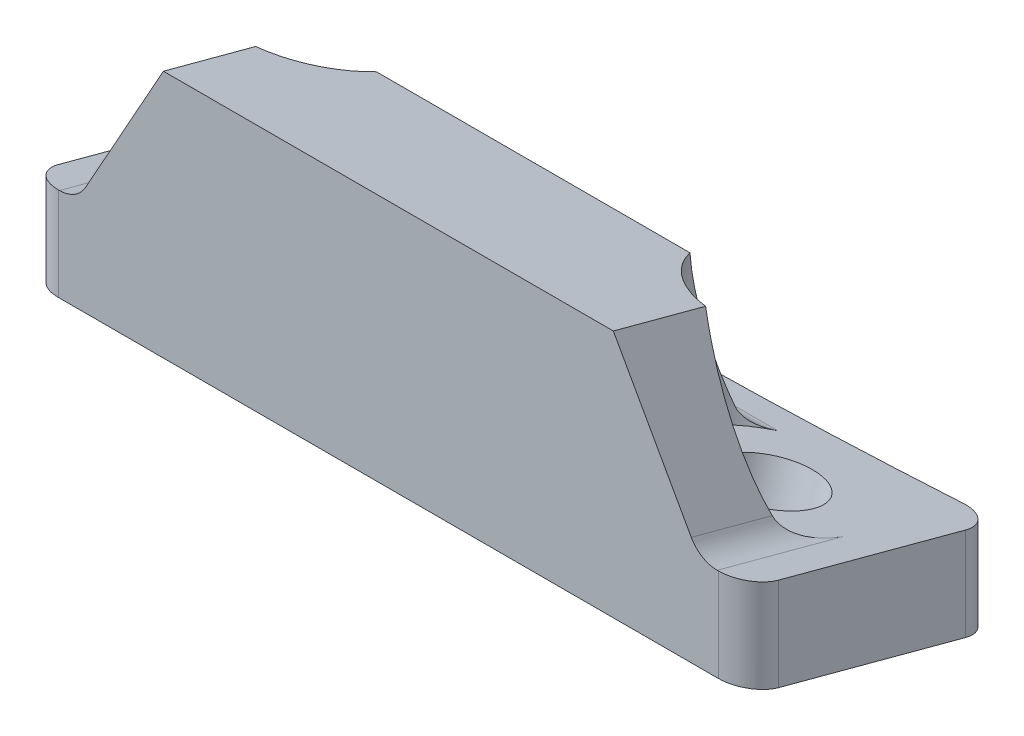
ISO-10303-21;
HEADER;
FILE_DESCRIPTION(('STEP AP214'),'2;1');
FILE_NAME('part.step','',(''),(''),'','','');
FILE_SCHEMA(('AUTOMOTIVE_DESIGN { 1 0 10303 214 1 1 1 1 }'));
ENDSEC;
DATA;
#1=APPLICATION_CONTEXT('core data for automotive mechanical design processes');
#2=APPLICATION_PROTOCOL_DEFINITION('international standard','automotive_design',2000,#1);
#3=PRODUCT_CONTEXT('',#1,'mechanical');
#4=PRODUCT('Part','Part','',(#3));
#5=PRODUCT_RELATED_PRODUCT_CATEGORY('part','',(#4));
#6=PRODUCT_DEFINITION_FORMATION('','',#4);
#7=PRODUCT_DEFINITION_CONTEXT('part definition',#1,'design');
#8=PRODUCT_DEFINITION('design','',#6,#7);
#9=PRODUCT_DEFINITION_SHAPE('','',#8);
#10=(LENGTH_UNIT() NAMED_UNIT(*) SI_UNIT(.MILLI.,.METRE.));
#11=(NAMED_UNIT(*) PLANE_ANGLE_UNIT() SI_UNIT($,.RADIAN.));
#12=(NAMED_UNIT(*) SI_UNIT($,.STERADIAN.) SOLID_ANGLE_UNIT());
#13=UNCERTAINTY_MEASURE_WITH_UNIT(LENGTH_MEASURE(1.E-05),#10,'distance_accuracy_value','');
#14=(GEOMETRIC_REPRESENTATION_CONTEXT(3) GLOBAL_UNCERTAINTY_ASSIGNED_CONTEXT((#13)) GLOBAL_UNIT_ASSIGNED_CONTEXT((#10,
#11,#12)) REPRESENTATION_CONTEXT('',''));
#15=CARTESIAN_POINT('',(0.,0.,0.));
#16=DIRECTION('',(0.,0.,1.));
#17=DIRECTION('',(1.,0.,0.));
#18=AXIS2_PLACEMENT_3D('',#15,#16,#17);
#19=CARTESIAN_POINT('',(12.,1.0352761804101,3.86370330515627));
#20=DIRECTION('',(0.,0.,-1.));
#21=DIRECTION('',(-1.,0.,0.));
#22=AXIS2_PLACEMENT_3D('',#19,#20,#21);
#23=PLANE('',#22);
#24=DIRECTION('',(-1.,0.,0.));
#25=VECTOR('',#24,1.);
#26=CARTESIAN_POINT('',(12.,1.0352761804101,3.86370330515627));
#27=LINE('',#26,#25);
#28=CARTESIAN_POINT('',(11.,1.0352761804101,3.86370330515627));
#29=VERTEX_POINT('',#28);
#30=CARTESIAN_POINT('',(-11.,1.0352761804101,3.86370330515627));
#31=VERTEX_POINT('',#30);
#32=EDGE_CURVE('E181',#29,#31,#27,.T.);
#33=ORIENTED_EDGE('',*,*,#32,.F.);
#34=DIRECTION('',(0.,-1.,0.));
#35=VECTOR('',#34,1.);
#36=CARTESIAN_POINT('',(11.,1.0352761804101,3.86370330515627));
#37=LINE('',#36,#35);
#38=CARTESIAN_POINT('',(11.,4.14110472164035,3.86370330515627));
#39=VERTEX_POINT('',#38);
#40=EDGE_CURVE('E242',#29,#39,#37,.F.);
#41=ORIENTED_EDGE('',*,*,#40,.T.);
#42=DIRECTION('',(-1.,0.,0.));
#43=VECTOR('',#42,1.);
#44=CARTESIAN_POINT('',(12.,4.14110472164035,3.86370330515627));
#45=LINE('',#44,#43);
#46=CARTESIAN_POINT('',(10.9641016151378,4.14110472164035,3.86370330515627));
#47=VERTEX_POINT('',#46);
#48=EDGE_CURVE('E484',#39,#47,#45,.T.);
#49=ORIENTED_EDGE('',*,*,#48,.T.);
#50=CARTESIAN_POINT('',(10.9641016151378,5.17638090205044,3.86370330515627));
#51=DIRECTION('',(0.,0.,-1.));
#52=DIRECTION('',(0.,1.,0.));
#53=AXIS2_PLACEMENT_3D('',#50,#51,#52);
#54=ELLIPSE('',#53,1.03527618041008,1.);
#55=CARTESIAN_POINT('',(10.0980762113533,4.65874281184539,3.86370330515627));
#56=VERTEX_POINT('',#55);
#57=EDGE_CURVE('E12',#47,#56,#54,.T.);
#58=ORIENTED_EDGE('',*,*,#57,.T.);
#59=DIRECTION('',(-0.487058473848149,0.873369362327711,0.));
#60=VECTOR('',#59,1.);
#61=CARTESIAN_POINT('',(12.0906191989615,1.08581247198543,3.86370330515627));
#62=LINE('',#61,#60);
#63=CARTESIAN_POINT('',(7.5,9.31748562369077,3.86370330515627));
#64=VERTEX_POINT('',#63);
#65=EDGE_CURVE('E180',#64,#56,#62,.F.);
#66=ORIENTED_EDGE('',*,*,#65,.F.);
#67=DIRECTION('',(-1.,0.,0.));
#68=VECTOR('',#67,1.);
#69=CARTESIAN_POINT('',(12.,9.31748562369077,3.86370330515627));
#70=LINE('',#69,#68);
#71=CARTESIAN_POINT('',(-7.5,9.31748562369077,3.86370330515627));
#72=VERTEX_POINT('',#71);
#73=EDGE_CURVE('E172',#64,#72,#70,.T.);
#74=ORIENTED_EDGE('',*,*,#73,.T.);
#75=DIRECTION('',(-0.487058473848149,-0.873369362327711,0.));
#76=VECTOR('',#75,1.);
#77=CARTESIAN_POINT('',(-6.39719623222663,11.294979241291,3.86370330515627));
#78=LINE('',#77,#76);
#79=CARTESIAN_POINT('',(-10.0980762113533,4.65874281184539,3.86370330515627));
#80=VERTEX_POINT('',#79);
#81=EDGE_CURVE('E153',#80,#72,#78,.F.);
#82=ORIENTED_EDGE('',*,*,#81,.F.);
#83=CARTESIAN_POINT('',(-10.9641016151378,5.17638090205044,3.86370330515627));
#84=DIRECTION('',(0.,0.,-1.));
#85=DIRECTION('',(0.,-1.,0.));
#86=AXIS2_PLACEMENT_3D('',#83,#84,#85);
#87=ELLIPSE('',#86,1.03527618041008,1.);
#88=CARTESIAN_POINT('',(-10.9641016151378,4.14110472164035,3.86370330515627));
#89=VERTEX_POINT('',#88);
#90=EDGE_CURVE('E253',#80,#89,#87,.T.);
#91=ORIENTED_EDGE('',*,*,#90,.T.);
#92=CARTESIAN_POINT('',(-11.,4.14110472164035,3.86370330515627));
#93=VERTEX_POINT('',#92);
#94=EDGE_CURVE('E490',#89,#93,#45,.T.);
#95=ORIENTED_EDGE('',*,*,#94,.T.);
#96=DIRECTION('',(0.,-1.,0.));
#97=VECTOR('',#96,1.);
#98=CARTESIAN_POINT('',(-11.,1.0352761804101,3.86370330515627));
#99=LINE('',#98,#97);
#100=EDGE_CURVE('E240',#93,#31,#99,.T.);
#101=ORIENTED_EDGE('',*,*,#100,.T.);
#102=EDGE_LOOP('',(#33,#41,#49,#58,#66,#74,#82,#91,#95,#101));
#103=FACE_BOUND('',#102,.T.);
#104=ADVANCED_FACE('F33',(#103),#23,.F.);
#105=CARTESIAN_POINT('',(12.,9.31748562369077,3.86370330515627));
#106=DIRECTION('',(0.,-0.965925826289067,0.258819045102525));
#107=DIRECTION('',(0.,-0.258819045102525,-0.965925826289067));
#108=AXIS2_PLACEMENT_3D('',#105,#106,#107);
#109=PLANE('',#108);
#110=DIRECTION('',(-1.,0.,0.));
#111=VECTOR('',#110,1.);
#112=CARTESIAN_POINT('',(-7.5,8.02339039817815,-0.965925826289068));
#113=LINE('',#112,#111);
#114=CARTESIAN_POINT('',(5.22651954819752,8.02339039817815,-0.965925826289069));
#115=VERTEX_POINT('',#114);
#116=CARTESIAN_POINT('',(-5.22651954819752,8.02339039817815,-0.965925826289069));
#117=VERTEX_POINT('',#116);
#118=EDGE_CURVE('E526',#115,#117,#113,.T.);
#119=ORIENTED_EDGE('',*,*,#118,.T.);
#120=CARTESIAN_POINT('',(-8.,7.72740661031254,-2.0705523608202));
#121=DIRECTION('',(0.,-0.965925826289067,0.258819045102525));
#122=DIRECTION('',(0.,-0.258819045102525,-0.965925826289067));
#123=AXIS2_PLACEMENT_3D('',#120,#121,#122);
#124=CIRCLE('',#123,3.);
#125=CARTESIAN_POINT('',(-7.5,8.49300367041864,0.786694765621074));
#126=VERTEX_POINT('',#125);
#127=EDGE_CURVE('E174',#117,#126,#124,.T.);
#128=ORIENTED_EDGE('',*,*,#127,.T.);
#129=DIRECTION('',(0.,0.258819045102525,0.965925826289067));
#130=VECTOR('',#129,1.);
#131=CARTESIAN_POINT('',(-7.5,8.02339039817815,-0.965925826289068));
#132=LINE('',#131,#130);
#133=EDGE_CURVE('E157',#126,#72,#132,.T.);
#134=ORIENTED_EDGE('',*,*,#133,.T.);
#135=ORIENTED_EDGE('',*,*,#73,.F.);
#136=DIRECTION('',(0.,-0.258819045102525,-0.965925826289067));
#137=VECTOR('',#136,1.);
#138=CARTESIAN_POINT('',(7.5,8.02339039817815,-0.965925826289068));
#139=LINE('',#138,#137);
#140=CARTESIAN_POINT('',(7.5,8.49300367041864,0.786694765621073));
#141=VERTEX_POINT('',#140);
#142=EDGE_CURVE('E176',#64,#141,#139,.T.);
#143=ORIENTED_EDGE('',*,*,#142,.T.);
#144=CARTESIAN_POINT('',(8.,7.72740661031254,-2.0705523608202));
#145=DIRECTION('',(0.,-0.965925826289067,0.258819045102525));
#146=DIRECTION('',(0.,-0.258819045102525,-0.965925826289067));
#147=AXIS2_PLACEMENT_3D('',#144,#145,#146);
#148=CIRCLE('',#147,3.);
#149=EDGE_CURVE('E184',#141,#115,#148,.T.);
#150=ORIENTED_EDGE('',*,*,#149,.T.);
#151=EDGE_LOOP('',(#119,#128,#134,#135,#143,#150));
#152=FACE_BOUND('',#151,.T.);
#153=ADVANCED_FACE('F170',(#152),#109,.F.);
#154=CARTESIAN_POINT('',(-8.,27.0459231360939,-7.24693326287069));
#155=DIRECTION('',(0.,-0.965925826289067,0.258819045102525));
#156=DIRECTION('',(0.,-0.258819045102525,-0.965925826289067));
#157=AXIS2_PLACEMENT_3D('',#154,#155,#156);
#158=CYLINDRICAL_SURFACE('',#157,3.);
#159=CARTESIAN_POINT('',(-8.,5.81413732911589,-1.55789340202027));
#160=DIRECTION('',(0.,-0.258819045102518,0.965925826289069));
#161=DIRECTION('',(0.,-0.965925826289069,-0.258819045102518));
#162=AXIS2_PLACEMENT_3D('',#159,#160,#161);
#163=ELLIPSE('',#162,5.99999999999999,3.);
#164=CARTESIAN_POINT('',(-5.37617070731915,3.00429257575129,-2.31078903454113));
#165=VERTEX_POINT('',#164);
#166=EDGE_CURVE('E501',#165,#117,#163,.T.);
#167=ORIENTED_EDGE('',*,*,#166,.F.);
#168=CARTESIAN_POINT('',(-5.37617070731915,3.00429257575129,-2.31078903454113));
#169=CARTESIAN_POINT('',(-5.38375375809876,2.97786334421747,-2.31786821691371));
#170=CARTESIAN_POINT('',(-5.39196401316921,2.95191192237957,-2.3259876323711));
#171=CARTESIAN_POINT('',(-5.40963843413776,2.90114684418095,-2.34413393858338));
#172=CARTESIAN_POINT('',(-5.41910179833776,2.87633247392116,-2.35415961155004));
#173=CARTESIAN_POINT('',(-5.44923189637865,2.80418824423588,-2.38668564680003));
#174=CARTESIAN_POINT('',(-5.47175468199593,2.7587479079092,-2.41174869351753));
#175=CARTESIAN_POINT('',(-5.52143919647684,2.67415751293252,-2.4669702697651));
#176=CARTESIAN_POINT('',(-5.54859153073691,2.63499502109806,-2.49711847882375));
#177=CARTESIAN_POINT('',(-5.60719285449142,2.56317491219571,-2.560893434431));
#178=CARTESIAN_POINT('',(-5.63864924457027,2.53052874262612,-2.59452614766534));
#179=CARTESIAN_POINT('',(-5.71848263450526,2.46014253677542,-2.67734136975477));
#180=CARTESIAN_POINT('',(-5.76863698035313,2.4254796329155,-2.72742085057355));
#181=CARTESIAN_POINT('',(-5.87477943039827,2.36756873424914,-2.82795832889667));
#182=CARTESIAN_POINT('',(-5.93077489314333,2.34433535390946,-2.8784167276889));
#183=CARTESIAN_POINT('',(-6.00687856160768,2.32024771274354,-2.9431416989836));
#184=CARTESIAN_POINT('',(-6.02499050624652,2.3150364985999,-2.95827734201769));
#185=CARTESIAN_POINT('',(-6.06154675934484,2.30548298911001,-2.98828072004946));
#186=CARTESIAN_POINT('',(-6.07998963298905,2.30113762677347,-3.00314922458455));
#187=CARTESIAN_POINT('',(-6.0986209555527,2.29718579456474,-3.01789581572768));
#188=B_SPLINE_CURVE_WITH_KNOTS('',3,(#168,#169,#170,#171,#172,#173,#174,#175,#176,#177,#178,
#179,#180,#181,#182,#183,#184,#185,#186,#187),.UNSPECIFIED.,.F.,.F.,(4,2,2,2,2,2,2,2,2,4),(0.,
0.0851142200188443,0.17017424749453,0.338991805846359,0.507470778612254,0.67624316983897,
0.911644691261538,1.14734643370626,1.21985180629734,1.2920955996428),.UNSPECIFIED.);
#189=CARTESIAN_POINT('',(-6.0986209555527,2.29718579456474,-3.01789581572768));
#190=VERTEX_POINT('',#189);
#191=EDGE_CURVE('E263',#165,#190,#188,.T.);
#192=ORIENTED_EDGE('',*,*,#191,.T.);
#193=CARTESIAN_POINT('',(-8.,2.8977774788672,-0.776457135307574));
#194=DIRECTION('',(0.,-0.965925826289067,0.258819045102525));
#195=DIRECTION('',(0.,-0.258819045102525,-0.965925826289067));
#196=AXIS2_PLACEMENT_3D('',#193,#194,#195);
#197=CIRCLE('',#196,3.);
#198=CARTESIAN_POINT('',(-10.9641016151378,3.01753593877125,-0.32951247830948));
#199=VERTEX_POINT('',#198);
#200=EDGE_CURVE('E195',#190,#199,#197,.T.);
#201=ORIENTED_EDGE('',*,*,#200,.T.);
#202=CARTESIAN_POINT('',(-10.9641016151378,3.01753593877125,-0.32951247830948));
#203=CARTESIAN_POINT('',(-10.9577962400731,3.02799304848034,-0.290498238765388));
#204=CARTESIAN_POINT('',(-10.9506659779932,3.03846670954159,-0.251626660901893));
#205=CARTESIAN_POINT('',(-10.9347662267443,3.05954956486411,-0.174253837071816));
#206=CARTESIAN_POINT('',(-10.9259966019882,3.07015877026821,-0.135752622014037));
#207=CARTESIAN_POINT('',(-10.8971939146216,3.10239940050016,-0.0207326081471663));
#208=CARTESIAN_POINT('',(-10.8747015915625,3.12438781094838,0.0550883979561434));
#209=CARTESIAN_POINT('',(-10.8231327612515,3.17062467204328,0.204565567009902));
#210=CARTESIAN_POINT('',(-10.7939997835879,3.19489139037663,0.278196654125814));
#211=CARTESIAN_POINT('',(-10.7296382872361,3.24700086843709,0.421305568859992));
#212=CARTESIAN_POINT('',(-10.6944199573135,3.27483763103691,0.490790081608333));
#213=CARTESIAN_POINT('',(-10.6211972562213,3.33381960985904,0.619442680891861));
#214=CARTESIAN_POINT('',(-10.5835687987088,3.36458907007985,0.678992994739172));
#215=CARTESIAN_POINT('',(-10.5045916224283,3.4326070035392,0.791592879516509));
#216=CARTESIAN_POINT('',(-10.4632464994022,3.46984924647545,0.844648618785602));
#217=CARTESIAN_POINT('',(-10.3779406759402,3.55331638855543,0.942952632993078));
#218=CARTESIAN_POINT('',(-10.3339488769981,3.59967447678677,0.988063623923384));
#219=CARTESIAN_POINT('',(-10.2473683056148,3.70241878619754,1.06649495576648));
#220=CARTESIAN_POINT('',(-10.2047730742829,3.75874760987337,1.09987968080616));
#221=CARTESIAN_POINT('',(-10.153451306071,3.83841470269665,1.13395159547056));
#222=CARTESIAN_POINT('',(-10.1418813174784,3.85725775178436,1.14117237446025));
#223=CARTESIAN_POINT('',(-10.1194250476986,3.89583679658623,1.15428752043789));
#224=CARTESIAN_POINT('',(-10.1085398979309,3.91557418186318,1.16017973195015));
#225=CARTESIAN_POINT('',(-10.0980762113533,3.93572931252477,1.16538019113359));
#226=B_SPLINE_CURVE_WITH_KNOTS('',3,(#202,#203,#204,#205,#206,#207,#208,#209,#210,#211,#212,
#213,#214,#215,#216,#217,#218,#219,#220,#221,#222,#223,#224,#225),.UNSPECIFIED.,.F.,.F.,(4,2,2,
2,2,2,2,2,2,2,2,4),(0.,0.122623445663207,0.24525703765572,0.491194287646272,0.739306573032794,
0.987007397167188,1.21710336519374,1.44697907131479,1.68050331891869,1.91272456548921,
1.98245432124352,2.05229640573011),.UNSPECIFIED.);
#227=CARTESIAN_POINT('',(-10.0980762113533,3.93572931252477,1.16538019113359));
#228=VERTEX_POINT('',#227);
#229=EDGE_CURVE('E255',#199,#228,#226,.T.);
#230=ORIENTED_EDGE('',*,*,#229,.T.);
#231=CARTESIAN_POINT('',(-8.,6.89089030657473,-1.84640849277818));
#232=DIRECTION('',(0.866025403784438,-0.482962913144534,0.129409522551263));
#233=DIRECTION('',(-0.500000000000001,-0.836516303737807,0.224143868042017));
#234=AXIS2_PLACEMENT_3D('',#231,#232,#233);
#235=ELLIPSE('',#234,5.99999999999999,3.);
#236=EDGE_CURVE('E164',#126,#228,#235,.T.);
#237=ORIENTED_EDGE('',*,*,#236,.F.);
#238=ORIENTED_EDGE('',*,*,#127,.F.);
#239=EDGE_LOOP('',(#167,#192,#201,#230,#237,#238));
#240=FACE_BOUND('',#239,.T.);
#241=ADVANCED_FACE('F270',(#240),#158,.F.);
#242=CARTESIAN_POINT('',(8.,27.0459231360939,-7.24693326287069));
#243=DIRECTION('',(0.,-0.965925826289067,0.258819045102525));
#244=DIRECTION('',(0.,-0.258819045102525,-0.965925826289067));
#245=AXIS2_PLACEMENT_3D('',#242,#243,#244);
#246=CYLINDRICAL_SURFACE('',#245,3.);
#247=CARTESIAN_POINT('',(8.,5.81413732911589,-1.55789340202027));
#248=DIRECTION('',(0.,-0.258819045102518,0.965925826289069));
#249=DIRECTION('',(0.,-0.965925826289069,-0.258819045102518));
#250=AXIS2_PLACEMENT_3D('',#247,#248,#249);
#251=ELLIPSE('',#250,5.99999999999999,3.);
#252=CARTESIAN_POINT('',(5.37617070731915,3.00429257575129,-2.31078903454113));
#253=VERTEX_POINT('',#252);
#254=EDGE_CURVE('E498',#115,#253,#251,.T.);
#255=ORIENTED_EDGE('',*,*,#254,.F.);
#256=ORIENTED_EDGE('',*,*,#149,.F.);
#257=CARTESIAN_POINT('',(8.,6.89089030657473,-1.84640849277818));
#258=DIRECTION('',(-0.866025403784438,-0.482962913144534,0.129409522551263));
#259=DIRECTION('',(0.500000000000001,-0.836516303737807,0.224143868042017));
#260=AXIS2_PLACEMENT_3D('',#257,#258,#259);
#261=ELLIPSE('',#260,5.99999999999999,3.);
#262=CARTESIAN_POINT('',(10.0980762113533,3.93572931252477,1.16538019113359));
#263=VERTEX_POINT('',#262);
#264=EDGE_CURVE('E489',#263,#141,#261,.T.);
#265=ORIENTED_EDGE('',*,*,#264,.F.);
#266=CARTESIAN_POINT('',(10.0980762113533,3.93572931252477,1.16538019113359));
#267=CARTESIAN_POINT('',(10.1117982142394,3.90929309243127,1.15856637839141));
#268=CARTESIAN_POINT('',(10.1262474213873,3.88358004349536,1.15055030645764));
#269=CARTESIAN_POINT('',(10.1562485545229,3.83370840366169,1.13226080116993));
#270=CARTESIAN_POINT('',(10.1717984552246,3.80954710618316,1.12199144432042));
#271=CARTESIAN_POINT('',(10.2192335184896,3.74002750181159,1.08827744948226));
#272=CARTESIAN_POINT('',(10.2522807482687,3.69693835983757,1.06174074586283));
#273=CARTESIAN_POINT('',(10.3285268233946,3.60571215707482,0.99331898453359));
#274=CARTESIAN_POINT('',(10.3719948751602,3.55949939324317,0.949218025456272));
#275=CARTESIAN_POINT('',(10.4573078965653,3.47534376464449,0.852000380081372));
#276=CARTESIAN_POINT('',(10.4991426553866,3.43744765254601,0.798835567410932));
#277=CARTESIAN_POINT('',(10.5699012596892,3.37626171674853,0.69883111188958));
#278=CARTESIAN_POINT('',(10.599588036176,3.35161428011378,0.653330477543673));
#279=CARTESIAN_POINT('',(10.656263960597,3.30543312552946,0.559148501790381));
#280=CARTESIAN_POINT('',(10.6832514970196,3.28390126426784,0.510465288646637));
#281=CARTESIAN_POINT('',(10.734217862769,3.24318927514343,0.410540136984989));
#282=CARTESIAN_POINT('',(10.7581931364648,3.22401192711113,0.359295272594246));
#283=CARTESIAN_POINT('',(10.8029135062696,3.18737309062844,0.254816251063502));
#284=CARTESIAN_POINT('',(10.823657650732,3.16991210824624,0.201581513559977));
#285=CARTESIAN_POINT('',(10.8700120455029,3.12885331738159,0.0702653150898261));
#286=CARTESIAN_POINT('',(10.8938643026512,3.10585536108185,-0.00863318385964483));
#287=CARTESIAN_POINT('',(10.924248527005,3.07222920816286,-0.128271260401016));
#288=CARTESIAN_POINT('',(10.9334579190889,3.06119746272078,-0.168243700700089));
#289=CARTESIAN_POINT('',(10.9501086728695,3.03928340338319,-0.248596366115771));
#290=CARTESIAN_POINT('',(10.9575500145703,3.02840109117903,-0.288976595838917));
#291=CARTESIAN_POINT('',(10.9641016151378,3.01753593877125,-0.329512478309485));
#292=B_SPLINE_CURVE_WITH_KNOTS('',3,(#266,#267,#268,#269,#270,#271,#272,#273,#274,#275,#276,
#277,#278,#279,#280,#281,#282,#283,#284,#285,#286,#287,#288,#289,#290,#291),.UNSPECIFIED.,.F.,
.F.,(4,2,2,2,2,2,2,2,2,2,2,2,4),(0.,0.0915735029261373,0.182982682979397,0.363402523674479,
0.593955383632091,0.825772877269919,1.00451115625662,1.18335551721012,1.36240903876638,
1.54151519665276,1.79784131007094,1.9252413320123,2.0526427947236),.UNSPECIFIED.);
#293=CARTESIAN_POINT('',(10.9641016151378,3.01753593877125,-0.329512478309485));
#294=VERTEX_POINT('',#293);
#295=EDGE_CURVE('E41',#263,#294,#292,.T.);
#296=ORIENTED_EDGE('',*,*,#295,.T.);
#297=CARTESIAN_POINT('',(8.,2.8977774788672,-0.776457135307574));
#298=DIRECTION('',(0.,-0.965925826289067,0.258819045102525));
#299=DIRECTION('',(0.,-0.258819045102525,-0.965925826289067));
#300=AXIS2_PLACEMENT_3D('',#297,#298,#299);
#301=CIRCLE('',#300,3.);
#302=CARTESIAN_POINT('',(6.0986209555527,2.29718579456474,-3.01789581572768));
#303=VERTEX_POINT('',#302);
#304=EDGE_CURVE('E505',#294,#303,#301,.T.);
#305=ORIENTED_EDGE('',*,*,#304,.T.);
#306=CARTESIAN_POINT('',(6.0986209555527,2.29718579456474,-3.01789581572768));
#307=CARTESIAN_POINT('',(6.0660710457246,2.30408976614552,-2.99214173435292));
#308=CARTESIAN_POINT('',(6.03407340194407,2.31220160299732,-2.96597983764932));
#309=CARTESIAN_POINT('',(5.97129332322677,2.33115118908544,-2.91306210115806));
#310=CARTESIAN_POINT('',(5.94051344084748,2.34199434596548,-2.88630518026383));
#311=CARTESIAN_POINT('',(5.88015741267718,2.36679568691229,-2.83229726937542));
#312=CARTESIAN_POINT('',(5.85059360880098,2.38077937208263,-2.80504401568142));
#313=CARTESIAN_POINT('',(5.79319107379338,2.41206821097027,-2.75068393357643));
#314=CARTESIAN_POINT('',(5.765350900001,2.42937053591197,-2.72357700053139));
#315=CARTESIAN_POINT('',(5.69840270514866,2.4769192033729,-2.65679085963854));
#316=CARTESIAN_POINT('',(5.66045720985126,2.50935399031296,-2.61745903967394));
#317=CARTESIAN_POINT('',(5.58975175190037,2.582494320062,-2.54221007428229));
#318=CARTESIAN_POINT('',(5.55697478896137,2.62317169785593,-2.5062818962123));
#319=CARTESIAN_POINT('',(5.50088403580178,2.70698147846072,-2.44419316509643));
#320=CARTESIAN_POINT('',(5.47689992110008,2.74917567583935,-2.41737330597134));
#321=CARTESIAN_POINT('',(5.43363399630301,2.83898299193823,-2.36969436541329));
#322=CARTESIAN_POINT('',(5.41434441045643,2.88658695566309,-2.3488254172461));
#323=CARTESIAN_POINT('',(5.39367904254046,2.94736007908501,-2.32779870312732));
#324=CARTESIAN_POINT('',(5.39000699318979,2.95862039362511,-2.32412527337734));
#325=CARTESIAN_POINT('',(5.38290765670499,2.98132114505027,-2.31716591602264));
#326=CARTESIAN_POINT('',(5.37948009907563,2.992761365233,-2.3138795574717));
#327=CARTESIAN_POINT('',(5.37617070731908,3.00429257575125,-2.31078903454108));
#328=B_SPLINE_CURVE_WITH_KNOTS('',3,(#306,#307,#308,#309,#310,#311,#312,#313,#314,#315,#316,
#317,#318,#319,#320,#321,#322,#323,#324,#325,#326,#327),.UNSPECIFIED.,.F.,.F.,(4,2,2,2,2,2,2,2,
2,2,4),(0.,0.126237192897191,0.252726310252718,0.380282248193717,0.507729938068686,
0.697621784839899,0.886875391450239,1.05253617981596,1.21792068052511,1.25511669696037,
1.29227090166657),.UNSPECIFIED.);
#329=EDGE_CURVE('E290',#303,#253,#328,.T.);
#330=ORIENTED_EDGE('',*,*,#329,.T.);
#331=EDGE_LOOP('',(#255,#256,#265,#296,#305,#330));
#332=FACE_BOUND('',#331,.T.);
#333=ADVANCED_FACE('F299',(#332),#246,.F.);
#334=CARTESIAN_POINT('',(12.,1.0352761804101,3.86370330515627));
#335=DIRECTION('',(0.,0.965925826289067,-0.258819045102525));
#336=DIRECTION('',(0.,0.258819045102525,0.965925826289067));
#337=AXIS2_PLACEMENT_3D('',#334,#335,#336);
#338=PLANE('',#337);
#339=CARTESIAN_POINT('',(-8.,0.,0.));
#340=DIRECTION('',(0.,-0.965925826289067,0.258819045102525));
#341=DIRECTION('',(0.,-0.258819045102525,-0.965925826289067));
#342=AXIS2_PLACEMENT_3D('',#339,#340,#341);
#343=CIRCLE('',#342,1.55);
#344=CARTESIAN_POINT('',(-8.,-0.401169519908913,-1.49718503074805));
#345=VERTEX_POINT('',#344);
#346=EDGE_CURVE('E508',#345,#345,#343,.T.);
#347=ORIENTED_EDGE('',*,*,#346,.F.);
#348=EDGE_LOOP('',(#347));
#349=FACE_BOUND('',#348,.T.);
#350=CARTESIAN_POINT('',(8.,0.,0.));
#351=DIRECTION('',(0.,-0.965925826289067,0.258819045102525));
#352=DIRECTION('',(0.,0.258819045102525,0.965925826289067));
#353=AXIS2_PLACEMENT_3D('',#350,#351,#352);
#354=CIRCLE('',#353,1.55);
#355=CARTESIAN_POINT('',(8.,0.401169519908913,1.49718503074805));
#356=VERTEX_POINT('',#355);
#357=EDGE_CURVE('E198',#356,#356,#354,.T.);
#358=ORIENTED_EDGE('',*,*,#357,.F.);
#359=EDGE_LOOP('',(#358));
#360=FACE_BOUND('',#359,.T.);
#361=DIRECTION('',(0.,-0.258819045102525,-0.965925826289067));
#362=VECTOR('',#361,1.);
#363=CARTESIAN_POINT('',(12.,1.0352761804101,3.86370330515627));
#364=LINE('',#363,#362);
#365=CARTESIAN_POINT('',(12.,0.767326987978972,2.86370330515627));
#366=VERTEX_POINT('',#365);
#367=CARTESIAN_POINT('',(12.,-0.905956884871102,-3.38107712380572));
#368=VERTEX_POINT('',#367);
#369=EDGE_CURVE('E182',#366,#368,#364,.T.);
#370=ORIENTED_EDGE('',*,*,#369,.F.);
#371=CARTESIAN_POINT('',(11.,0.767326987978972,2.86370330515627));
#372=DIRECTION('',(0.,0.965925826289067,-0.258819045102525));
#373=DIRECTION('',(0.,-0.258819045102525,-0.965925826289067));
#374=AXIS2_PLACEMENT_3D('',#371,#372,#373);
#375=ELLIPSE('',#374,1.03527618041008,1.);
#376=EDGE_CURVE('E56',#366,#29,#375,.F.);
#377=ORIENTED_EDGE('',*,*,#376,.T.);
#378=ORIENTED_EDGE('',*,*,#32,.T.);
#379=CARTESIAN_POINT('',(-11.,0.767326987978972,2.86370330515627));
#380=DIRECTION('',(0.,0.965925826289067,-0.258819045102525));
#381=DIRECTION('',(0.,0.258819045102525,0.965925826289067));
#382=AXIS2_PLACEMENT_3D('',#379,#380,#381);
#383=ELLIPSE('',#382,1.03527618041008,1.);
#384=CARTESIAN_POINT('',(-12.,0.767326987978972,2.86370330515627));
#385=VERTEX_POINT('',#384);
#386=EDGE_CURVE('E48',#31,#385,#383,.F.);
#387=ORIENTED_EDGE('',*,*,#386,.T.);
#388=DIRECTION('',(0.,-0.258819045102525,-0.965925826289067));
#389=VECTOR('',#388,1.);
#390=CARTESIAN_POINT('',(-12.,1.0352761804101,3.86370330515627));
#391=LINE('',#390,#389);
#392=CARTESIAN_POINT('',(-12.,-0.905956884871102,-3.38107712380572));
#393=VERTEX_POINT('',#392);
#394=EDGE_CURVE('E187',#385,#393,#391,.T.);
#395=ORIENTED_EDGE('',*,*,#394,.T.);
#396=CARTESIAN_POINT('',(-11.,-0.905956884871102,-3.38107712380573));
#397=DIRECTION('',(0.,0.965925826289067,-0.258819045102525));
#398=DIRECTION('',(0.,0.258819045102525,0.965925826289067));
#399=AXIS2_PLACEMENT_3D('',#396,#397,#398);
#400=ELLIPSE('',#399,1.03527618041008,1.);
#401=CARTESIAN_POINT('',(-10.9126984126984,-1.17288302788301,-4.37725905139454));
#402=VERTEX_POINT('',#401);
#403=EDGE_CURVE('E236',#393,#402,#400,.F.);
#404=ORIENTED_EDGE('',*,*,#403,.T.);
#405=CARTESIAN_POINT('',(0.,-34.5386509043723,-128.9));
#406=DIRECTION('',(0.,0.965925826289067,-0.258819045102525));
#407=DIRECTION('',(0.,0.258819045102525,0.965925826289067));
#408=AXIS2_PLACEMENT_3D('',#405,#406,#407);
#409=ELLIPSE('',#408,129.409522551261,125.);
#410=CARTESIAN_POINT('',(10.9126984126984,-1.17288302788301,-4.37725905139454));
#411=VERTEX_POINT('',#410);
#412=EDGE_CURVE('E163',#402,#411,#409,.T.);
#413=ORIENTED_EDGE('',*,*,#412,.T.);
#414=CARTESIAN_POINT('',(11.,-0.905956884871102,-3.38107712380573));
#415=DIRECTION('',(0.,0.965925826289067,-0.258819045102525));
#416=DIRECTION('',(0.,0.258819045102525,0.965925826289067));
#417=AXIS2_PLACEMENT_3D('',#414,#415,#416);
#418=ELLIPSE('',#417,1.03527618041008,1.);
#419=EDGE_CURVE('E234',#411,#368,#418,.F.);
#420=ORIENTED_EDGE('',*,*,#419,.T.);
#421=EDGE_LOOP('',(#370,#377,#378,#387,#395,#404,#413,#420));
#422=FACE_BOUND('',#421,.T.);
#423=ADVANCED_FACE('F303',(#349,#360,#422),#338,.F.);
#424=CARTESIAN_POINT('',(12.,0.,0.));
#425=DIRECTION('',(-1.,0.,0.));
#426=DIRECTION('',(0.,0.,1.));
#427=AXIS2_PLACEMENT_3D('',#424,#425,#426);
#428=PLANE('',#427);
#429=DIRECTION('',(0.,0.258819045102525,0.965925826289067));
#430=VECTOR('',#429,1.);
#431=CARTESIAN_POINT('',(12.,2.8977774788672,-0.776457135307574));
#432=LINE('',#431,#430);
#433=CARTESIAN_POINT('',(12.,2.19987165635915,-3.38107712380573));
#434=VERTEX_POINT('',#433);
#435=CARTESIAN_POINT('',(12.,3.87315552920922,2.86370330515627));
#436=VERTEX_POINT('',#435);
#437=EDGE_CURVE('E479',#434,#436,#432,.T.);
#438=ORIENTED_EDGE('',*,*,#437,.T.);
#439=DIRECTION('',(0.,-1.,0.));
#440=VECTOR('',#439,1.);
#441=CARTESIAN_POINT('',(12.,0.,2.86370330515627));
#442=LINE('',#441,#440);
#443=EDGE_CURVE('E231',#436,#366,#442,.T.);
#444=ORIENTED_EDGE('',*,*,#443,.T.);
#445=ORIENTED_EDGE('',*,*,#369,.T.);
#446=DIRECTION('',(0.,1.,0.));
#447=VECTOR('',#446,1.);
#448=CARTESIAN_POINT('',(12.,0.,-3.38107712380573));
#449=LINE('',#448,#447);
#450=EDGE_CURVE('E228',#368,#434,#449,.T.);
#451=ORIENTED_EDGE('',*,*,#450,.T.);
#452=EDGE_LOOP('',(#438,#444,#445,#451));
#453=FACE_BOUND('',#452,.T.);
#454=ADVANCED_FACE('F316',(#453),#428,.F.);
#455=CARTESIAN_POINT('',(-12.,0.,0.));
#456=DIRECTION('',(-1.,0.,0.));
#457=DIRECTION('',(0.,0.,1.));
#458=AXIS2_PLACEMENT_3D('',#455,#456,#457);
#459=PLANE('',#458);
#460=ORIENTED_EDGE('',*,*,#394,.F.);
#461=DIRECTION('',(0.,-1.,0.));
#462=VECTOR('',#461,1.);
#463=CARTESIAN_POINT('',(-12.,4.14110472164035,2.86370330515627));
#464=LINE('',#463,#462);
#465=CARTESIAN_POINT('',(-12.,3.87315552920922,2.86370330515627));
#466=VERTEX_POINT('',#465);
#467=EDGE_CURVE('E246',#385,#466,#464,.F.);
#468=ORIENTED_EDGE('',*,*,#467,.T.);
#469=DIRECTION('',(0.,0.258819045102525,0.965925826289067));
#470=VECTOR('',#469,1.);
#471=CARTESIAN_POINT('',(-12.,2.8977774788672,-0.776457135307574));
#472=LINE('',#471,#470);
#473=CARTESIAN_POINT('',(-12.,2.19987165635915,-3.38107712380573));
#474=VERTEX_POINT('',#473);
#475=EDGE_CURVE('E175',#474,#466,#472,.T.);
#476=ORIENTED_EDGE('',*,*,#475,.F.);
#477=DIRECTION('',(0.,-1.,0.));
#478=VECTOR('',#477,1.);
#479=CARTESIAN_POINT('',(-12.,-1.19969782985477,-3.38107712380573));
#480=LINE('',#479,#478);
#481=EDGE_CURVE('E244',#474,#393,#480,.T.);
#482=ORIENTED_EDGE('',*,*,#481,.T.);
#483=EDGE_LOOP('',(#460,#468,#476,#482));
#484=FACE_BOUND('',#483,.T.);
#485=ADVANCED_FACE('F314',(#484),#459,.T.);
#486=CARTESIAN_POINT('',(8.,9.90073971946297,-2.65289521230089));
#487=DIRECTION('',(0.,-0.965925826289067,0.258819045102525));
#488=DIRECTION('',(0.,-0.258819045102525,-0.965925826289067));
#489=AXIS2_PLACEMENT_3D('',#486,#487,#488);
#490=CYLINDRICAL_SURFACE('',#489,1.55);
#491=CARTESIAN_POINT('',(8.,2.8977774788672,-0.776457135307574));
#492=DIRECTION('',(0.,-0.965925826289067,0.258819045102525));
#493=DIRECTION('',(0.,-0.258819045102525,-0.965925826289067));
#494=AXIS2_PLACEMENT_3D('',#491,#492,#493);
#495=CIRCLE('',#494,1.55);
#496=CARTESIAN_POINT('',(8.,2.49660795895829,-2.27364216605563));
#497=VERTEX_POINT('',#496);
#498=EDGE_CURVE('E194',#497,#497,#495,.F.);
#499=ORIENTED_EDGE('',*,*,#498,.T.);
#500=EDGE_LOOP('',(#499));
#501=FACE_BOUND('',#500,.T.);
#502=ORIENTED_EDGE('',*,*,#357,.T.);
#503=EDGE_LOOP('',(#502));
#504=FACE_BOUND('',#503,.T.);
#505=ADVANCED_FACE('F310',(#501,#504),#490,.F.);
#506=CARTESIAN_POINT('',(-8.,9.90073971946297,-2.65289521230089));
#507=DIRECTION('',(0.,-0.965925826289067,0.258819045102525));
#508=DIRECTION('',(0.,-0.258819045102525,-0.965925826289067));
#509=AXIS2_PLACEMENT_3D('',#506,#507,#508);
#510=CYLINDRICAL_SURFACE('',#509,1.55);
#511=CARTESIAN_POINT('',(-8.,2.8977774788672,-0.776457135307574));
#512=DIRECTION('',(0.,-0.965925826289067,0.258819045102525));
#513=DIRECTION('',(0.,-0.258819045102525,-0.965925826289067));
#514=AXIS2_PLACEMENT_3D('',#511,#512,#513);
#515=CIRCLE('',#514,1.55);
#516=CARTESIAN_POINT('',(-8.,2.49660795895829,-2.27364216605563));
#517=VERTEX_POINT('',#516);
#518=EDGE_CURVE('E191',#517,#517,#515,.F.);
#519=ORIENTED_EDGE('',*,*,#518,.T.);
#520=EDGE_LOOP('',(#519));
#521=FACE_BOUND('',#520,.T.);
#522=ORIENTED_EDGE('',*,*,#346,.T.);
#523=EDGE_LOOP('',(#522));
#524=FACE_BOUND('',#523,.T.);
#525=ADVANCED_FACE('F305',(#521,#524),#510,.F.);
#526=CARTESIAN_POINT('',(-8.,2.8977774788672,-0.776457135307574));
#527=DIRECTION('',(0.,-0.965925826289067,0.258819045102525));
#528=DIRECTION('',(0.,-0.258819045102525,-0.965925826289067));
#529=AXIS2_PLACEMENT_3D('',#526,#527,#528);
#530=PLANE('',#529);
#531=ORIENTED_EDGE('',*,*,#94,.F.);
#532=DIRECTION('',(0.,-0.258819045102525,-0.965925826289067));
#533=VECTOR('',#532,1.);
#534=CARTESIAN_POINT('',(-10.9641016151378,2.8977774788672,-0.776457135307574));
#535=LINE('',#534,#533);
#536=EDGE_CURVE('E219',#89,#199,#535,.T.);
#537=ORIENTED_EDGE('',*,*,#536,.T.);
#538=ORIENTED_EDGE('',*,*,#200,.F.);
#539=DIRECTION('',(1.,0.,0.));
#540=VECTOR('',#539,1.);
#541=CARTESIAN_POINT('',(-8.,2.29718579456474,-3.01789581572768));
#542=LINE('',#541,#540);
#543=EDGE_CURVE('E216',#190,#303,#542,.T.);
#544=ORIENTED_EDGE('',*,*,#543,.T.);
#545=ORIENTED_EDGE('',*,*,#304,.F.);
#546=DIRECTION('',(0.,0.258819045102525,0.965925826289067));
#547=VECTOR('',#546,1.);
#548=CARTESIAN_POINT('',(10.9641016151378,2.8977774788672,-0.776457135307577));
#549=LINE('',#548,#547);
#550=EDGE_CURVE('E214',#294,#47,#549,.T.);
#551=ORIENTED_EDGE('',*,*,#550,.T.);
#552=ORIENTED_EDGE('',*,*,#48,.F.);
#553=CARTESIAN_POINT('',(11.,3.87315552920922,2.86370330515627));
#554=DIRECTION('',(0.,-0.965925826289067,0.258819045102525));
#555=DIRECTION('',(0.,-0.258819045102525,-0.965925826289067));
#556=AXIS2_PLACEMENT_3D('',#553,#554,#555);
#557=ELLIPSE('',#556,1.03527618041008,1.);
#558=EDGE_CURVE('E212',#39,#436,#557,.F.);
#559=ORIENTED_EDGE('',*,*,#558,.T.);
#560=ORIENTED_EDGE('',*,*,#437,.F.);
#561=CARTESIAN_POINT('',(11.,2.19987165635915,-3.38107712380573));
#562=DIRECTION('',(0.,-0.965925826289067,0.258819045102525));
#563=DIRECTION('',(0.,0.258819045102525,0.965925826289067));
#564=AXIS2_PLACEMENT_3D('',#561,#562,#563);
#565=ELLIPSE('',#564,1.03527618041008,1.);
#566=CARTESIAN_POINT('',(10.9126984126984,1.93294551334725,-4.37725905139454));
#567=VERTEX_POINT('',#566);
#568=EDGE_CURVE('E206',#434,#567,#565,.F.);
#569=ORIENTED_EDGE('',*,*,#568,.T.);
#570=CARTESIAN_POINT('',(0.,-31.432822363142,-128.9));
#571=DIRECTION('',(0.,-0.965925826289067,0.258819045102525));
#572=DIRECTION('',(0.,0.258819045102525,0.965925826289067));
#573=AXIS2_PLACEMENT_3D('',#570,#571,#572);
#574=ELLIPSE('',#573,129.409522551261,125.);
#575=CARTESIAN_POINT('',(-10.9126984126984,1.93294551334725,-4.37725905139454));
#576=VERTEX_POINT('',#575);
#577=EDGE_CURVE('E202',#576,#567,#574,.F.);
#578=ORIENTED_EDGE('',*,*,#577,.F.);
#579=CARTESIAN_POINT('',(-11.,2.19987165635915,-3.38107712380573));
#580=DIRECTION('',(0.,-0.965925826289067,0.258819045102525));
#581=DIRECTION('',(0.,0.258819045102525,0.965925826289067));
#582=AXIS2_PLACEMENT_3D('',#579,#580,#581);
#583=ELLIPSE('',#582,1.03527618041008,1.);
#584=EDGE_CURVE('E208',#576,#474,#583,.F.);
#585=ORIENTED_EDGE('',*,*,#584,.T.);
#586=ORIENTED_EDGE('',*,*,#475,.T.);
#587=CARTESIAN_POINT('',(-11.,3.87315552920922,2.86370330515627));
#588=DIRECTION('',(0.,-0.965925826289067,0.258819045102525));
#589=DIRECTION('',(0.,0.258819045102525,0.965925826289067));
#590=AXIS2_PLACEMENT_3D('',#587,#588,#589);
#591=ELLIPSE('',#590,1.03527618041008,1.);
#592=EDGE_CURVE('E210',#466,#93,#591,.F.);
#593=ORIENTED_EDGE('',*,*,#592,.T.);
#594=EDGE_LOOP('',(#531,#537,#538,#544,#545,#551,#552,#559,#560,#569,#578,#585,#586,#593));
#595=FACE_BOUND('',#594,.T.);
#596=ORIENTED_EDGE('',*,*,#518,.F.);
#597=EDGE_LOOP('',(#596));
#598=FACE_BOUND('',#597,.T.);
#599=ORIENTED_EDGE('',*,*,#498,.F.);
#600=EDGE_LOOP('',(#599));
#601=FACE_BOUND('',#600,.T.);
#602=ADVANCED_FACE('F309',(#595,#598,#601),#530,.F.);
#603=CARTESIAN_POINT('',(0.,-1.29409522551262,-128.9));
#604=DIRECTION('',(0.,1.,0.));
#605=DIRECTION('',(0.,0.,1.));
#606=AXIS2_PLACEMENT_3D('',#603,#604,#605);
#607=CYLINDRICAL_SURFACE('',#606,125.);
#608=ORIENTED_EDGE('',*,*,#412,.F.);
#609=DIRECTION('',(0.,1.,0.));
#610=VECTOR('',#609,1.);
#611=CARTESIAN_POINT('',(-10.9126984126984,-1.29409522551262,-4.37725905139456));
#612=LINE('',#611,#610);
#613=EDGE_CURVE('E250',#402,#576,#612,.T.);
#614=ORIENTED_EDGE('',*,*,#613,.T.);
#615=ORIENTED_EDGE('',*,*,#577,.T.);
#616=DIRECTION('',(0.,1.,0.));
#617=VECTOR('',#616,1.);
#618=CARTESIAN_POINT('',(10.9126984126984,-1.29409522551262,-4.37725905139456));
#619=LINE('',#618,#617);
#620=EDGE_CURVE('E248',#567,#411,#619,.F.);
#621=ORIENTED_EDGE('',*,*,#620,.T.);
#622=EDGE_LOOP('',(#608,#614,#615,#621));
#623=FACE_BOUND('',#622,.T.);
#624=ADVANCED_FACE('F375',(#623),#607,.F.);
#625=CARTESIAN_POINT('',(-7.5,8.02339039817815,-0.965925826289068));
#626=DIRECTION('',(0.866025403784438,-0.482962913144534,0.129409522551263));
#627=DIRECTION('',(0.487058473848149,0.873369362327711,0.));
#628=AXIS2_PLACEMENT_3D('',#625,#626,#627);
#629=PLANE('',#628);
#630=ORIENTED_EDGE('',*,*,#236,.T.);
#631=DIRECTION('',(0.,0.258819045102525,0.965925826289067));
#632=VECTOR('',#631,1.);
#633=CARTESIAN_POINT('',(-10.0980762113533,3.67672417987735,0.198759876672292));
#634=LINE('',#633,#632);
#635=EDGE_CURVE('E160',#228,#80,#634,.T.);
#636=ORIENTED_EDGE('',*,*,#635,.T.);
#637=ORIENTED_EDGE('',*,*,#81,.T.);
#638=ORIENTED_EDGE('',*,*,#133,.F.);
#639=EDGE_LOOP('',(#630,#636,#637,#638));
#640=FACE_BOUND('',#639,.T.);
#641=ADVANCED_FACE('F156',(#640),#629,.F.);
#642=CARTESIAN_POINT('',(-7.5,8.02339039817815,-0.965925826289068));
#643=DIRECTION('',(0.,-0.258819045102518,0.965925826289069));
#644=DIRECTION('',(0.,-0.965925826289069,-0.258819045102518));
#645=AXIS2_PLACEMENT_3D('',#642,#643,#644);
#646=PLANE('',#645);
#647=ORIENTED_EDGE('',*,*,#254,.T.);
#648=DIRECTION('',(-1.,0.,0.));
#649=VECTOR('',#648,1.);
#650=CARTESIAN_POINT('',(-7.5,3.00429257575129,-2.31078903454113));
#651=LINE('',#650,#649);
#652=EDGE_CURVE('E222',#253,#165,#651,.T.);
#653=ORIENTED_EDGE('',*,*,#652,.T.);
#654=ORIENTED_EDGE('',*,*,#166,.T.);
#655=ORIENTED_EDGE('',*,*,#118,.F.);
#656=EDGE_LOOP('',(#647,#653,#654,#655));
#657=FACE_BOUND('',#656,.T.);
#658=ADVANCED_FACE('F394',(#657),#646,.F.);
#659=CARTESIAN_POINT('',(7.5,8.02339039817815,-0.965925826289068));
#660=DIRECTION('',(-0.866025403784438,-0.482962913144534,0.129409522551263));
#661=DIRECTION('',(0.487058473848149,-0.873369362327711,0.));
#662=AXIS2_PLACEMENT_3D('',#659,#660,#661);
#663=PLANE('',#662);
#664=ORIENTED_EDGE('',*,*,#65,.T.);
#665=DIRECTION('',(0.,-0.258819045102525,-0.965925826289067));
#666=VECTOR('',#665,1.);
#667=CARTESIAN_POINT('',(10.0980762113533,3.67672417987734,0.198759876672292));
#668=LINE('',#667,#666);
#669=EDGE_CURVE('E225',#56,#263,#668,.T.);
#670=ORIENTED_EDGE('',*,*,#669,.T.);
#671=ORIENTED_EDGE('',*,*,#264,.T.);
#672=ORIENTED_EDGE('',*,*,#142,.F.);
#673=EDGE_LOOP('',(#664,#670,#671,#672));
#674=FACE_BOUND('',#673,.T.);
#675=ADVANCED_FACE('F279',(#674),#663,.F.);
#676=CARTESIAN_POINT('',(-10.9641016151378,4.15968709302188,0.0693503541210297));
#677=DIRECTION('',(0.,-0.258819045102525,-0.965925826289067));
#678=DIRECTION('',(0.,0.965925826289067,-0.258819045102525));
#679=AXIS2_PLACEMENT_3D('',#676,#677,#678);
#680=CYLINDRICAL_SURFACE('',#679,1.);
#681=ORIENTED_EDGE('',*,*,#229,.F.);
#682=ORIENTED_EDGE('',*,*,#536,.F.);
#683=ORIENTED_EDGE('',*,*,#90,.F.);
#684=ORIENTED_EDGE('',*,*,#635,.F.);
#685=EDGE_LOOP('',(#681,#682,#683,#684));
#686=FACE_BOUND('',#685,.T.);
#687=ADVANCED_FACE('F274',(#686),#680,.F.);
#688=CARTESIAN_POINT('',(-7.5,3.26311162085381,-3.2767148608302));
#689=DIRECTION('',(1.,0.,0.));
#690=DIRECTION('',(0.,0.,-1.));
#691=AXIS2_PLACEMENT_3D('',#688,#689,#690);
#692=CYLINDRICAL_SURFACE('',#691,1.);
#693=ORIENTED_EDGE('',*,*,#329,.F.);
#694=ORIENTED_EDGE('',*,*,#543,.F.);
#695=ORIENTED_EDGE('',*,*,#191,.F.);
#696=ORIENTED_EDGE('',*,*,#652,.F.);
#697=EDGE_LOOP('',(#693,#694,#695,#696));
#698=FACE_BOUND('',#697,.T.);
#699=ADVANCED_FACE('F278',(#698),#692,.F.);
#700=CARTESIAN_POINT('',(10.9641016151378,4.15968709302188,0.0693503541210297));
#701=DIRECTION('',(0.,0.258819045102525,0.965925826289067));
#702=DIRECTION('',(0.,-0.965925826289067,0.258819045102525));
#703=AXIS2_PLACEMENT_3D('',#700,#701,#702);
#704=CYLINDRICAL_SURFACE('',#703,1.);
#705=ORIENTED_EDGE('',*,*,#57,.F.);
#706=ORIENTED_EDGE('',*,*,#550,.F.);
#707=ORIENTED_EDGE('',*,*,#295,.F.);
#708=ORIENTED_EDGE('',*,*,#669,.F.);
#709=EDGE_LOOP('',(#705,#706,#707,#708));
#710=FACE_BOUND('',#709,.T.);
#711=ADVANCED_FACE('F285',(#710),#704,.F.);
#712=CARTESIAN_POINT('',(11.,0.,2.86370330515627));
#713=DIRECTION('',(0.,-1.,0.));
#714=DIRECTION('',(0.,0.,-1.));
#715=AXIS2_PLACEMENT_3D('',#712,#713,#714);
#716=CYLINDRICAL_SURFACE('',#715,1.);
#717=ORIENTED_EDGE('',*,*,#558,.F.);
#718=ORIENTED_EDGE('',*,*,#40,.F.);
#719=ORIENTED_EDGE('',*,*,#376,.F.);
#720=ORIENTED_EDGE('',*,*,#443,.F.);
#721=EDGE_LOOP('',(#717,#718,#719,#720));
#722=FACE_BOUND('',#721,.T.);
#723=ADVANCED_FACE('F433',(#722),#716,.T.);
#724=CARTESIAN_POINT('',(-11.,1.0352761804101,2.86370330515627));
#725=DIRECTION('',(0.,1.,0.));
#726=DIRECTION('',(0.,0.,1.));
#727=AXIS2_PLACEMENT_3D('',#724,#725,#726);
#728=CYLINDRICAL_SURFACE('',#727,1.);
#729=ORIENTED_EDGE('',*,*,#592,.F.);
#730=ORIENTED_EDGE('',*,*,#467,.F.);
#731=ORIENTED_EDGE('',*,*,#386,.F.);
#732=ORIENTED_EDGE('',*,*,#100,.F.);
#733=EDGE_LOOP('',(#729,#730,#731,#732));
#734=FACE_BOUND('',#733,.T.);
#735=ADVANCED_FACE('F442',(#734),#728,.T.);
#736=CARTESIAN_POINT('',(-11.,-1.29409522551262,-3.38107712380573));
#737=DIRECTION('',(0.,1.,0.));
#738=DIRECTION('',(0.,0.,1.));
#739=AXIS2_PLACEMENT_3D('',#736,#737,#738);
#740=CYLINDRICAL_SURFACE('',#739,1.);
#741=ORIENTED_EDGE('',*,*,#403,.F.);
#742=ORIENTED_EDGE('',*,*,#481,.F.);
#743=ORIENTED_EDGE('',*,*,#584,.F.);
#744=ORIENTED_EDGE('',*,*,#613,.F.);
#745=EDGE_LOOP('',(#741,#742,#743,#744));
#746=FACE_BOUND('',#745,.T.);
#747=ADVANCED_FACE('F451',(#746),#740,.T.);
#748=CARTESIAN_POINT('',(11.,-1.29409522551262,-3.38107712380573));
#749=DIRECTION('',(0.,1.,0.));
#750=DIRECTION('',(0.,0.,1.));
#751=AXIS2_PLACEMENT_3D('',#748,#749,#750);
#752=CYLINDRICAL_SURFACE('',#751,1.);
#753=ORIENTED_EDGE('',*,*,#419,.F.);
#754=ORIENTED_EDGE('',*,*,#620,.F.);
#755=ORIENTED_EDGE('',*,*,#568,.F.);
#756=ORIENTED_EDGE('',*,*,#450,.F.);
#757=EDGE_LOOP('',(#753,#754,#755,#756));
#758=FACE_BOUND('',#757,.T.);
#759=ADVANCED_FACE('F35',(#758),#752,.T.);
#760=CLOSED_SHELL('',(#104,#153,#241,#333,#423,#454,#485,#505,#525,#602,#624,#641,#658,#675,
#687,#699,#711,#723,#735,#747,#759));
#761=MANIFOLD_SOLID_BREP('B2',#760);
#762=ADVANCED_BREP_SHAPE_REPRESENTATION('',(#18,#761),#14);
#763=SHAPE_DEFINITION_REPRESENTATION(#9,#762);
ENDSEC;
END-ISO-10303-21;
